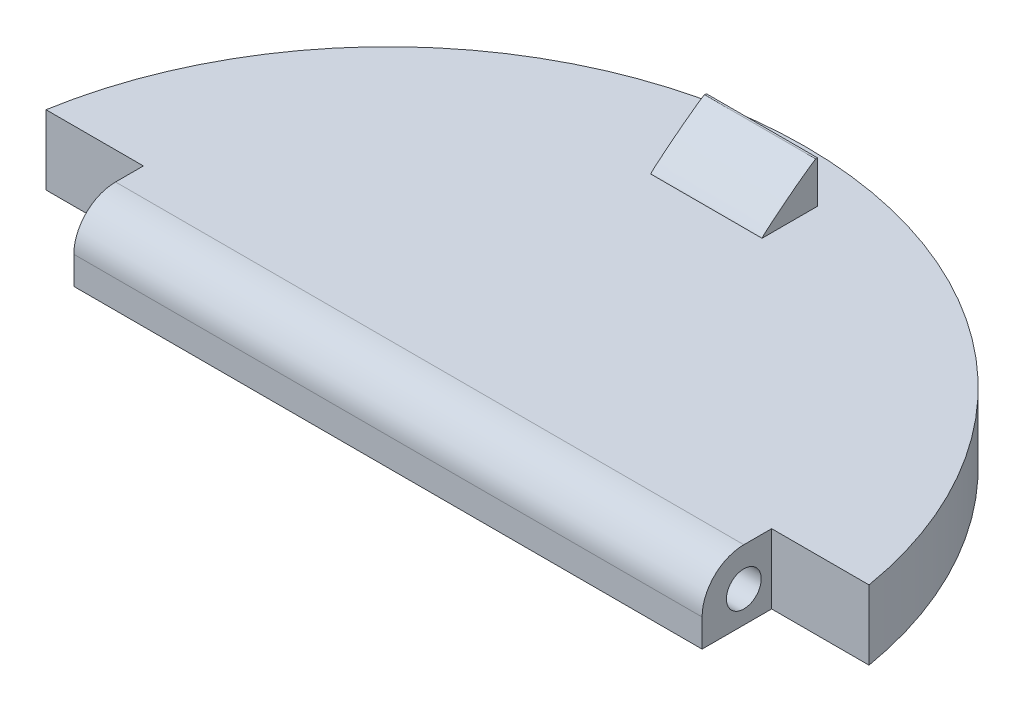
ISO-10303-21;
HEADER;
FILE_DESCRIPTION(('STEP AP214'),'2;1');
FILE_NAME('part.step','',(''),(''),'','','');
FILE_SCHEMA(('AUTOMOTIVE_DESIGN { 1 0 10303 214 1 1 1 1 }'));
ENDSEC;
DATA;
#1=APPLICATION_CONTEXT('core data for automotive mechanical design processes');
#2=APPLICATION_PROTOCOL_DEFINITION('international standard','automotive_design',2000,#1);
#3=PRODUCT_CONTEXT('',#1,'mechanical');
#4=PRODUCT('Part','Part','',(#3));
#5=PRODUCT_RELATED_PRODUCT_CATEGORY('part','',(#4));
#6=PRODUCT_DEFINITION_FORMATION('','',#4);
#7=PRODUCT_DEFINITION_CONTEXT('part definition',#1,'design');
#8=PRODUCT_DEFINITION('design','',#6,#7);
#9=PRODUCT_DEFINITION_SHAPE('','',#8);
#10=(LENGTH_UNIT() NAMED_UNIT(*) SI_UNIT(.MILLI.,.METRE.));
#11=(NAMED_UNIT(*) PLANE_ANGLE_UNIT() SI_UNIT($,.RADIAN.));
#12=(NAMED_UNIT(*) SI_UNIT($,.STERADIAN.) SOLID_ANGLE_UNIT());
#13=UNCERTAINTY_MEASURE_WITH_UNIT(LENGTH_MEASURE(1.E-05),#10,'distance_accuracy_value','');
#14=(GEOMETRIC_REPRESENTATION_CONTEXT(3) GLOBAL_UNCERTAINTY_ASSIGNED_CONTEXT((#13)) GLOBAL_UNIT_ASSIGNED_CONTEXT((#10,
#11,#12)) REPRESENTATION_CONTEXT('',''));
#15=CARTESIAN_POINT('',(0.,0.,0.));
#16=DIRECTION('',(0.,0.,1.));
#17=DIRECTION('',(1.,0.,0.));
#18=AXIS2_PLACEMENT_3D('',#15,#16,#17);
#19=CARTESIAN_POINT('',(0.,5.,0.));
#20=DIRECTION('',(0.,1.,0.));
#21=DIRECTION('',(0.,0.,1.));
#22=AXIS2_PLACEMENT_3D('',#19,#20,#21);
#23=PLANE('',#22);
#24=DIRECTION('',(0.,0.,-1.));
#25=VECTOR('',#24,1.);
#26=CARTESIAN_POINT('',(-22.5803989154981,5.,0.));
#27=LINE('',#26,#25);
#28=CARTESIAN_POINT('',(-22.5803989154981,5.,-3.));
#29=VERTEX_POINT('',#28);
#30=CARTESIAN_POINT('',(-22.5803989154981,5.,-5.));
#31=VERTEX_POINT('',#30);
#32=EDGE_CURVE('E125',#29,#31,#27,.T.);
#33=ORIENTED_EDGE('',*,*,#32,.F.);
#34=DIRECTION('',(1.,0.,0.));
#35=VECTOR('',#34,1.);
#36=CARTESIAN_POINT('',(22.5803989154981,5.,-3.));
#37=LINE('',#36,#35);
#38=CARTESIAN_POINT('',(22.5803989154981,5.,-3.));
#39=VERTEX_POINT('',#38);
#40=EDGE_CURVE('E241',#29,#39,#37,.T.);
#41=ORIENTED_EDGE('',*,*,#40,.T.);
#42=DIRECTION('',(0.,0.,1.));
#43=VECTOR('',#42,1.);
#44=CARTESIAN_POINT('',(22.5803989154981,5.,0.));
#45=LINE('',#44,#43);
#46=CARTESIAN_POINT('',(22.5803989154981,5.,-5.));
#47=VERTEX_POINT('',#46);
#48=EDGE_CURVE('E167',#47,#39,#45,.T.);
#49=ORIENTED_EDGE('',*,*,#48,.F.);
#50=DIRECTION('',(-1.,0.,0.));
#51=VECTOR('',#50,1.);
#52=CARTESIAN_POINT('',(22.5803989154981,5.,-5.));
#53=LINE('',#52,#51);
#54=CARTESIAN_POINT('',(29.5803989154981,5.,-5.));
#55=VERTEX_POINT('',#54);
#56=EDGE_CURVE('E163',#55,#47,#53,.T.);
#57=ORIENTED_EDGE('',*,*,#56,.F.);
#58=CARTESIAN_POINT('',(0.,5.,0.));
#59=DIRECTION('',(0.,1.,0.));
#60=DIRECTION('',(0.,0.,1.));
#61=AXIS2_PLACEMENT_3D('',#58,#59,#60);
#62=CIRCLE('',#61,30.);
#63=CARTESIAN_POINT('',(-29.5803989154981,5.,-5.));
#64=VERTEX_POINT('',#63);
#65=EDGE_CURVE('E153',#55,#64,#62,.T.);
#66=ORIENTED_EDGE('',*,*,#65,.T.);
#67=DIRECTION('',(-1.,0.,0.));
#68=VECTOR('',#67,1.);
#69=CARTESIAN_POINT('',(-22.5803989154981,5.,-5.));
#70=LINE('',#69,#68);
#71=EDGE_CURVE('E136',#31,#64,#70,.T.);
#72=ORIENTED_EDGE('',*,*,#71,.F.);
#73=EDGE_LOOP('',(#33,#41,#49,#57,#66,#72));
#74=FACE_BOUND('',#73,.T.);
#75=DIRECTION('',(-1.,0.,0.));
#76=VECTOR('',#75,1.);
#77=CARTESIAN_POINT('',(-3.84159331598207,5.,-26.7316665793187));
#78=LINE('',#77,#76);
#79=CARTESIAN_POINT('',(4.15840668401793,5.,-26.7316665793187));
#80=VERTEX_POINT('',#79);
#81=CARTESIAN_POINT('',(-3.84159331598207,5.,-26.7316665793187));
#82=VERTEX_POINT('',#81);
#83=EDGE_CURVE('E200',#80,#82,#78,.T.);
#84=ORIENTED_EDGE('',*,*,#83,.F.);
#85=DIRECTION('',(0.,0.,-1.));
#86=VECTOR('',#85,1.);
#87=CARTESIAN_POINT('',(4.15840668401793,5.,-26.7316665793187));
#88=LINE('',#87,#86);
#89=CARTESIAN_POINT('',(4.15840668401793,5.,-22.7316665793187));
#90=VERTEX_POINT('',#89);
#91=EDGE_CURVE('E161',#90,#80,#88,.T.);
#92=ORIENTED_EDGE('',*,*,#91,.F.);
#93=CARTESIAN_POINT('',(-4.24159331598207,5.,-22.7316665793187));
#94=CARTESIAN_POINT('',(-1.30825998264874,5.,-22.7316665793187));
#95=CARTESIAN_POINT('',(1.6250733506846,5.,-22.7316665793187));
#96=CARTESIAN_POINT('',(4.55840668401793,5.,-22.7316665793187));
#97=(BOUNDED_CURVE() B_SPLINE_CURVE(3,(#93,#94,#95,#96),.UNSPECIFIED.,.F.,
.F.) B_SPLINE_CURVE_WITH_KNOTS((4,4),(-0.00455840668401793,0.00424159331598207),
.UNSPECIFIED.) CURVE() GEOMETRIC_REPRESENTATION_ITEM() RATIONAL_B_SPLINE_CURVE((1.,1.,1.,1.)) REPRESENTATION_ITEM(''));
#98=CARTESIAN_POINT('',(-3.84159331598207,5.,-22.7316665793187));
#99=VERTEX_POINT('',#98);
#100=EDGE_CURVE('E188',#99,#90,#97,.T.);
#101=ORIENTED_EDGE('',*,*,#100,.F.);
#102=DIRECTION('',(0.,0.,1.));
#103=VECTOR('',#102,1.);
#104=CARTESIAN_POINT('',(-3.84159331598207,5.,-26.7316665793187));
#105=LINE('',#104,#103);
#106=EDGE_CURVE('E203',#82,#99,#105,.T.);
#107=ORIENTED_EDGE('',*,*,#106,.F.);
#108=EDGE_LOOP('',(#84,#92,#101,#107));
#109=FACE_BOUND('',#108,.T.);
#110=ADVANCED_FACE('F44',(#74,#109),#23,.T.);
#111=CARTESIAN_POINT('',(0.,5.,0.));
#112=DIRECTION('',(0.,-1.,0.));
#113=DIRECTION('',(0.,0.,-1.));
#114=AXIS2_PLACEMENT_3D('',#111,#112,#113);
#115=CYLINDRICAL_SURFACE('',#114,30.);
#116=CARTESIAN_POINT('',(0.,0.,0.));
#117=DIRECTION('',(0.,1.,0.));
#118=DIRECTION('',(0.,0.,1.));
#119=AXIS2_PLACEMENT_3D('',#116,#117,#118);
#120=CIRCLE('',#119,30.);
#121=CARTESIAN_POINT('',(29.5803989154981,0.,-5.));
#122=VERTEX_POINT('',#121);
#123=CARTESIAN_POINT('',(-29.5803989154981,0.,-5.));
#124=VERTEX_POINT('',#123);
#125=EDGE_CURVE('E210',#122,#124,#120,.T.);
#126=ORIENTED_EDGE('',*,*,#125,.T.);
#127=DIRECTION('',(0.,1.,0.));
#128=VECTOR('',#127,1.);
#129=CARTESIAN_POINT('',(-29.5803989154981,-5.,-5.));
#130=LINE('',#129,#128);
#131=EDGE_CURVE('E146',#124,#64,#130,.T.);
#132=ORIENTED_EDGE('',*,*,#131,.T.);
#133=ORIENTED_EDGE('',*,*,#65,.F.);
#134=DIRECTION('',(0.,1.,0.));
#135=VECTOR('',#134,1.);
#136=CARTESIAN_POINT('',(29.5803989154981,-5.,-5.));
#137=LINE('',#136,#135);
#138=EDGE_CURVE('E171',#122,#55,#137,.T.);
#139=ORIENTED_EDGE('',*,*,#138,.F.);
#140=EDGE_LOOP('',(#126,#132,#133,#139));
#141=FACE_BOUND('',#140,.T.);
#142=ADVANCED_FACE('F251',(#141),#115,.T.);
#143=CARTESIAN_POINT('',(-30.,5.,0.));
#144=DIRECTION('',(0.,0.,-1.));
#145=DIRECTION('',(-1.,0.,0.));
#146=AXIS2_PLACEMENT_3D('',#143,#144,#145);
#147=PLANE('',#146);
#148=DIRECTION('',(0.,1.,0.));
#149=VECTOR('',#148,1.);
#150=CARTESIAN_POINT('',(22.5803989154981,-5.,0.));
#151=LINE('',#150,#149);
#152=CARTESIAN_POINT('',(22.5803989154981,0.,0.));
#153=VERTEX_POINT('',#152);
#154=CARTESIAN_POINT('',(22.5803989154981,2.,0.));
#155=VERTEX_POINT('',#154);
#156=EDGE_CURVE('E137',#153,#155,#151,.T.);
#157=ORIENTED_EDGE('',*,*,#156,.T.);
#158=DIRECTION('',(1.,0.,0.));
#159=VECTOR('',#158,1.);
#160=CARTESIAN_POINT('',(-22.5803989154981,2.,0.));
#161=LINE('',#160,#159);
#162=CARTESIAN_POINT('',(-22.5803989154981,2.,0.));
#163=VERTEX_POINT('',#162);
#164=EDGE_CURVE('E52',#155,#163,#161,.F.);
#165=ORIENTED_EDGE('',*,*,#164,.T.);
#166=DIRECTION('',(0.,1.,0.));
#167=VECTOR('',#166,1.);
#168=CARTESIAN_POINT('',(-22.5803989154981,-5.,0.));
#169=LINE('',#168,#167);
#170=CARTESIAN_POINT('',(-22.5803989154981,0.,0.));
#171=VERTEX_POINT('',#170);
#172=EDGE_CURVE('E147',#171,#163,#169,.T.);
#173=ORIENTED_EDGE('',*,*,#172,.F.);
#174=DIRECTION('',(1.,0.,0.));
#175=VECTOR('',#174,1.);
#176=CARTESIAN_POINT('',(-30.,0.,0.));
#177=LINE('',#176,#175);
#178=EDGE_CURVE('E189',#171,#153,#177,.T.);
#179=ORIENTED_EDGE('',*,*,#178,.T.);
#180=EDGE_LOOP('',(#157,#165,#173,#179));
#181=FACE_BOUND('',#180,.T.);
#182=ADVANCED_FACE('F221',(#181),#147,.F.);
#183=CARTESIAN_POINT('',(0.,0.,0.));
#184=DIRECTION('',(0.,1.,0.));
#185=DIRECTION('',(0.,0.,1.));
#186=AXIS2_PLACEMENT_3D('',#183,#184,#185);
#187=PLANE('',#186);
#188=DIRECTION('',(0.,0.,-1.));
#189=VECTOR('',#188,1.);
#190=CARTESIAN_POINT('',(-22.5803989154981,0.,0.));
#191=LINE('',#190,#189);
#192=CARTESIAN_POINT('',(-22.5803989154981,0.,-5.));
#193=VERTEX_POINT('',#192);
#194=EDGE_CURVE('E225',#171,#193,#191,.T.);
#195=ORIENTED_EDGE('',*,*,#194,.T.);
#196=DIRECTION('',(-1.,0.,0.));
#197=VECTOR('',#196,1.);
#198=CARTESIAN_POINT('',(0.,0.,-5.));
#199=LINE('',#198,#197);
#200=EDGE_CURVE('E143',#193,#124,#199,.T.);
#201=ORIENTED_EDGE('',*,*,#200,.T.);
#202=ORIENTED_EDGE('',*,*,#125,.F.);
#203=DIRECTION('',(-1.,0.,0.));
#204=VECTOR('',#203,1.);
#205=CARTESIAN_POINT('',(0.,0.,-5.));
#206=LINE('',#205,#204);
#207=CARTESIAN_POINT('',(22.5803989154981,0.,-5.));
#208=VERTEX_POINT('',#207);
#209=EDGE_CURVE('E229',#122,#208,#206,.T.);
#210=ORIENTED_EDGE('',*,*,#209,.T.);
#211=DIRECTION('',(0.,0.,1.));
#212=VECTOR('',#211,1.);
#213=CARTESIAN_POINT('',(22.5803989154981,0.,0.));
#214=LINE('',#213,#212);
#215=EDGE_CURVE('E228',#208,#153,#214,.T.);
#216=ORIENTED_EDGE('',*,*,#215,.T.);
#217=ORIENTED_EDGE('',*,*,#178,.F.);
#218=EDGE_LOOP('',(#195,#201,#202,#210,#216,#217));
#219=FACE_BOUND('',#218,.T.);
#220=ADVANCED_FACE('F224',(#219),#187,.F.);
#221=CARTESIAN_POINT('',(4.15840668401793,8.,-26.7316665793187));
#222=DIRECTION('',(-1.,0.,0.));
#223=DIRECTION('',(0.,0.,1.));
#224=AXIS2_PLACEMENT_3D('',#221,#222,#223);
#225=PLANE('',#224);
#226=DIRECTION('',(0.,0.,-1.));
#227=VECTOR('',#226,1.);
#228=CARTESIAN_POINT('',(4.15840668401793,8.,-26.7316665793187));
#229=LINE('',#228,#227);
#230=CARTESIAN_POINT('',(4.15840668401793,8.,-26.6046499255261));
#231=VERTEX_POINT('',#230);
#232=CARTESIAN_POINT('',(4.15840668401793,8.,-26.7316665793187));
#233=VERTEX_POINT('',#232);
#234=EDGE_CURVE('E184',#231,#233,#229,.T.);
#235=ORIENTED_EDGE('',*,*,#234,.F.);
#236=CARTESIAN_POINT('',(4.15840668401793,5.,-22.7316665793187));
#237=CARTESIAN_POINT('',(4.15840668401793,8.,-23.5062632485602));
#238=CARTESIAN_POINT('',(4.15840668401793,8.,-26.6046499255261));
#239=(BOUNDED_CURVE() B_SPLINE_CURVE(2,(#236,#237,#238),.UNSPECIFIED.,.F.,
.F.) B_SPLINE_CURVE_WITH_KNOTS((3,3),(0.,1.),
.UNSPECIFIED.) CURVE() GEOMETRIC_REPRESENTATION_ITEM() RATIONAL_B_SPLINE_CURVE((1.,
0.0574959574576069,1.)) REPRESENTATION_ITEM(''));
#240=EDGE_CURVE('E350',#231,#90,#239,.F.);
#241=ORIENTED_EDGE('',*,*,#240,.T.);
#242=ORIENTED_EDGE('',*,*,#91,.T.);
#243=DIRECTION('',(0.,-1.,0.));
#244=VECTOR('',#243,1.);
#245=CARTESIAN_POINT('',(4.15840668401793,8.,-26.7316665793187));
#246=LINE('',#245,#244);
#247=EDGE_CURVE('E207',#233,#80,#246,.T.);
#248=ORIENTED_EDGE('',*,*,#247,.F.);
#249=EDGE_LOOP('',(#235,#241,#242,#248));
#250=FACE_BOUND('',#249,.T.);
#251=ADVANCED_FACE('F333',(#250),#225,.F.);
#252=CARTESIAN_POINT('',(-3.84159331598207,8.,-26.7316665793187));
#253=DIRECTION('',(0.,0.,1.));
#254=DIRECTION('',(1.,0.,0.));
#255=AXIS2_PLACEMENT_3D('',#252,#253,#254);
#256=PLANE('',#255);
#257=ORIENTED_EDGE('',*,*,#83,.T.);
#258=DIRECTION('',(0.,-1.,0.));
#259=VECTOR('',#258,1.);
#260=CARTESIAN_POINT('',(-3.84159331598207,8.,-26.7316665793187));
#261=LINE('',#260,#259);
#262=CARTESIAN_POINT('',(-3.84159331598207,8.,-26.7316665793187));
#263=VERTEX_POINT('',#262);
#264=EDGE_CURVE('E195',#263,#82,#261,.T.);
#265=ORIENTED_EDGE('',*,*,#264,.F.);
#266=DIRECTION('',(-1.,0.,0.));
#267=VECTOR('',#266,1.);
#268=CARTESIAN_POINT('',(-3.84159331598207,8.,-26.7316665793187));
#269=LINE('',#268,#267);
#270=EDGE_CURVE('E181',#233,#263,#269,.T.);
#271=ORIENTED_EDGE('',*,*,#270,.F.);
#272=ORIENTED_EDGE('',*,*,#247,.T.);
#273=EDGE_LOOP('',(#257,#265,#271,#272));
#274=FACE_BOUND('',#273,.T.);
#275=ADVANCED_FACE('F340',(#274),#256,.F.);
#276=CARTESIAN_POINT('',(-3.84159331598207,8.,-26.7316665793187));
#277=DIRECTION('',(1.,0.,0.));
#278=DIRECTION('',(0.,0.,-1.));
#279=AXIS2_PLACEMENT_3D('',#276,#277,#278);
#280=PLANE('',#279);
#281=ORIENTED_EDGE('',*,*,#106,.T.);
#282=CARTESIAN_POINT('',(-3.84159331598207,8.,-26.6046499255261));
#283=CARTESIAN_POINT('',(-3.84159331598207,8.,-23.5062632485602));
#284=CARTESIAN_POINT('',(-3.84159331598207,5.,-22.7316665793187));
#285=(BOUNDED_CURVE() B_SPLINE_CURVE(2,(#282,#283,#284),.UNSPECIFIED.,.F.,
.F.) B_SPLINE_CURVE_WITH_KNOTS((3,3),(0.,1.),
.UNSPECIFIED.) CURVE() GEOMETRIC_REPRESENTATION_ITEM() RATIONAL_B_SPLINE_CURVE((1.,
0.0574959574576069,1.)) REPRESENTATION_ITEM(''));
#286=CARTESIAN_POINT('',(-3.84159331598207,8.,-26.6046499255261));
#287=VERTEX_POINT('',#286);
#288=EDGE_CURVE('E235',#99,#287,#285,.F.);
#289=ORIENTED_EDGE('',*,*,#288,.T.);
#290=DIRECTION('',(0.,0.,1.));
#291=VECTOR('',#290,1.);
#292=CARTESIAN_POINT('',(-3.84159331598207,8.,-26.7316665793187));
#293=LINE('',#292,#291);
#294=EDGE_CURVE('E191',#263,#287,#293,.T.);
#295=ORIENTED_EDGE('',*,*,#294,.F.);
#296=ORIENTED_EDGE('',*,*,#264,.T.);
#297=EDGE_LOOP('',(#281,#289,#295,#296));
#298=FACE_BOUND('',#297,.T.);
#299=ADVANCED_FACE('F345',(#298),#280,.F.);
#300=CARTESIAN_POINT('',(0.,8.,0.));
#301=DIRECTION('',(0.,1.,0.));
#302=DIRECTION('',(0.,0.,1.));
#303=AXIS2_PLACEMENT_3D('',#300,#301,#302);
#304=PLANE('',#303);
#305=ORIENTED_EDGE('',*,*,#294,.T.);
#306=CARTESIAN_POINT('',(4.55840668401793,8.,-26.6046499255261));
#307=CARTESIAN_POINT('',(1.6250733506846,8.,-26.6046499255261));
#308=CARTESIAN_POINT('',(-1.30825998264874,8.,-26.6046499255261));
#309=CARTESIAN_POINT('',(-4.24159331598207,8.,-26.6046499255261));
#310=(BOUNDED_CURVE() B_SPLINE_CURVE(3,(#306,#307,#308,#309),.UNSPECIFIED.,.F.,
.F.) B_SPLINE_CURVE_WITH_KNOTS((4,4),(-0.00455840668401793,0.00424159331598207),
.UNSPECIFIED.) CURVE() GEOMETRIC_REPRESENTATION_ITEM() RATIONAL_B_SPLINE_CURVE((1.,1.,1.,1.)) REPRESENTATION_ITEM(''));
#311=EDGE_CURVE('E212',#287,#231,#310,.F.);
#312=ORIENTED_EDGE('',*,*,#311,.T.);
#313=ORIENTED_EDGE('',*,*,#234,.T.);
#314=ORIENTED_EDGE('',*,*,#270,.T.);
#315=EDGE_LOOP('',(#305,#312,#313,#314));
#316=FACE_BOUND('',#315,.T.);
#317=ADVANCED_FACE('F271',(#316),#304,.T.);
#318=CARTESIAN_POINT('',(4.55840668401793,5.,-22.7316665793187));
#319=CARTESIAN_POINT('',(1.6250733506846,5.,-22.7316665793187));
#320=CARTESIAN_POINT('',(-1.30825998264874,5.,-22.7316665793187));
#321=CARTESIAN_POINT('',(-4.24159331598207,5.,-22.7316665793187));
#322=CARTESIAN_POINT('',(4.55840668401793,8.,-23.5062632485602));
#323=CARTESIAN_POINT('',(1.6250733506846,8.,-23.5062632485602));
#324=CARTESIAN_POINT('',(-1.30825998264874,8.,-23.5062632485602));
#325=CARTESIAN_POINT('',(-4.24159331598207,8.,-23.5062632485602));
#326=CARTESIAN_POINT('',(4.55840668401793,8.,-26.6046499255261));
#327=CARTESIAN_POINT('',(1.6250733506846,8.,-26.6046499255261));
#328=CARTESIAN_POINT('',(-1.30825998264874,8.,-26.6046499255261));
#329=CARTESIAN_POINT('',(-4.24159331598207,8.,-26.6046499255261));
#330=(BOUNDED_SURFACE() B_SPLINE_SURFACE(2,3,((#318,#319,#320,#321),(#322,#323,#324,#325),(#326,
#327,#328,#329)),.UNSPECIFIED.,.F.,.F.,.F.) B_SPLINE_SURFACE_WITH_KNOTS((3,3),(4,4),(0.,1.),
(-0.00455840668401793,0.00424159331598207),
.UNSPECIFIED.) GEOMETRIC_REPRESENTATION_ITEM() RATIONAL_B_SPLINE_SURFACE(((1.,1.,1.,1.),
(0.0574959574576069,0.0574959574576069,0.0574959574576069,0.0574959574576069),(1.,1.,1.,1.))) REPRESENTATION_ITEM('') SURFACE());
#331=ORIENTED_EDGE('',*,*,#288,.F.);
#332=ORIENTED_EDGE('',*,*,#100,.T.);
#333=ORIENTED_EDGE('',*,*,#240,.F.);
#334=ORIENTED_EDGE('',*,*,#311,.F.);
#335=EDGE_LOOP('',(#331,#332,#333,#334));
#336=FACE_BOUND('',#335,.T.);
#337=ADVANCED_FACE('F264',(#336),#330,.T.);
#338=CARTESIAN_POINT('',(22.5803989154981,-5.,0.));
#339=DIRECTION('',(-1.,0.,0.));
#340=DIRECTION('',(0.,0.,1.));
#341=AXIS2_PLACEMENT_3D('',#338,#339,#340);
#342=PLANE('',#341);
#343=CARTESIAN_POINT('',(22.5803989154981,2.25,-3.));
#344=DIRECTION('',(1.,0.,0.));
#345=DIRECTION('',(0.,0.,-1.));
#346=AXIS2_PLACEMENT_3D('',#343,#344,#345);
#347=CIRCLE('',#346,1.25);
#348=CARTESIAN_POINT('',(22.5803989154981,2.25,-4.25));
#349=VERTEX_POINT('',#348);
#350=EDGE_CURVE('E425',#349,#349,#347,.T.);
#351=ORIENTED_EDGE('',*,*,#350,.F.);
#352=EDGE_LOOP('',(#351));
#353=FACE_BOUND('',#352,.T.);
#354=ORIENTED_EDGE('',*,*,#48,.T.);
#355=CARTESIAN_POINT('',(22.5803989154981,2.,-3.));
#356=DIRECTION('',(-1.,0.,0.));
#357=DIRECTION('',(0.,0.,1.));
#358=AXIS2_PLACEMENT_3D('',#355,#356,#357);
#359=CIRCLE('',#358,3.);
#360=EDGE_CURVE('E66',#39,#155,#359,.F.);
#361=ORIENTED_EDGE('',*,*,#360,.T.);
#362=ORIENTED_EDGE('',*,*,#156,.F.);
#363=ORIENTED_EDGE('',*,*,#215,.F.);
#364=DIRECTION('',(0.,1.,0.));
#365=VECTOR('',#364,1.);
#366=CARTESIAN_POINT('',(22.5803989154981,-5.,-5.));
#367=LINE('',#366,#365);
#368=EDGE_CURVE('E174',#208,#47,#367,.T.);
#369=ORIENTED_EDGE('',*,*,#368,.T.);
#370=EDGE_LOOP('',(#354,#361,#362,#363,#369));
#371=FACE_BOUND('',#370,.T.);
#372=ADVANCED_FACE('F248',(#353,#371),#342,.F.);
#373=CARTESIAN_POINT('',(22.5803989154981,-5.,-5.));
#374=DIRECTION('',(0.,0.,-1.));
#375=DIRECTION('',(-1.,0.,0.));
#376=AXIS2_PLACEMENT_3D('',#373,#374,#375);
#377=PLANE('',#376);
#378=ORIENTED_EDGE('',*,*,#138,.T.);
#379=ORIENTED_EDGE('',*,*,#56,.T.);
#380=ORIENTED_EDGE('',*,*,#368,.F.);
#381=ORIENTED_EDGE('',*,*,#209,.F.);
#382=EDGE_LOOP('',(#378,#379,#380,#381));
#383=FACE_BOUND('',#382,.T.);
#384=ADVANCED_FACE('F250',(#383),#377,.F.);
#385=CARTESIAN_POINT('',(-22.5803989154981,-5.,-5.));
#386=DIRECTION('',(0.,0.,-1.));
#387=DIRECTION('',(-1.,0.,0.));
#388=AXIS2_PLACEMENT_3D('',#385,#386,#387);
#389=PLANE('',#388);
#390=DIRECTION('',(0.,1.,0.));
#391=VECTOR('',#390,1.);
#392=CARTESIAN_POINT('',(-22.5803989154981,-5.,-5.));
#393=LINE('',#392,#391);
#394=EDGE_CURVE('E128',#193,#31,#393,.T.);
#395=ORIENTED_EDGE('',*,*,#394,.T.);
#396=ORIENTED_EDGE('',*,*,#71,.T.);
#397=ORIENTED_EDGE('',*,*,#131,.F.);
#398=ORIENTED_EDGE('',*,*,#200,.F.);
#399=EDGE_LOOP('',(#395,#396,#397,#398));
#400=FACE_BOUND('',#399,.T.);
#401=ADVANCED_FACE('F140',(#400),#389,.F.);
#402=CARTESIAN_POINT('',(-22.5803989154981,-5.,0.));
#403=DIRECTION('',(1.,0.,0.));
#404=DIRECTION('',(0.,0.,-1.));
#405=AXIS2_PLACEMENT_3D('',#402,#403,#404);
#406=PLANE('',#405);
#407=CARTESIAN_POINT('',(-22.5803989154981,2.25,-3.));
#408=DIRECTION('',(-1.,0.,0.));
#409=DIRECTION('',(0.,0.,1.));
#410=AXIS2_PLACEMENT_3D('',#407,#408,#409);
#411=CIRCLE('',#410,1.25);
#412=CARTESIAN_POINT('',(-22.5803989154981,2.25,-1.75));
#413=VERTEX_POINT('',#412);
#414=EDGE_CURVE('E426',#413,#413,#411,.T.);
#415=ORIENTED_EDGE('',*,*,#414,.F.);
#416=EDGE_LOOP('',(#415));
#417=FACE_BOUND('',#416,.T.);
#418=ORIENTED_EDGE('',*,*,#172,.T.);
#419=CARTESIAN_POINT('',(-22.5803989154981,2.,-3.));
#420=DIRECTION('',(1.,0.,0.));
#421=DIRECTION('',(0.,0.,-1.));
#422=AXIS2_PLACEMENT_3D('',#419,#420,#421);
#423=CIRCLE('',#422,3.);
#424=EDGE_CURVE('E12',#163,#29,#423,.F.);
#425=ORIENTED_EDGE('',*,*,#424,.T.);
#426=ORIENTED_EDGE('',*,*,#32,.T.);
#427=ORIENTED_EDGE('',*,*,#394,.F.);
#428=ORIENTED_EDGE('',*,*,#194,.F.);
#429=EDGE_LOOP('',(#418,#425,#426,#427,#428));
#430=FACE_BOUND('',#429,.T.);
#431=ADVANCED_FACE('F127',(#417,#430),#406,.F.);
#432=CARTESIAN_POINT('',(0.,2.,-3.));
#433=DIRECTION('',(-1.,0.,0.));
#434=DIRECTION('',(0.,0.,1.));
#435=AXIS2_PLACEMENT_3D('',#432,#433,#434);
#436=CYLINDRICAL_SURFACE('',#435,3.);
#437=ORIENTED_EDGE('',*,*,#424,.F.);
#438=ORIENTED_EDGE('',*,*,#164,.F.);
#439=ORIENTED_EDGE('',*,*,#360,.F.);
#440=ORIENTED_EDGE('',*,*,#40,.F.);
#441=EDGE_LOOP('',(#437,#438,#439,#440));
#442=FACE_BOUND('',#441,.T.);
#443=ADVANCED_FACE('F46',(#442),#436,.T.);
#444=CARTESIAN_POINT('',(17.5803989154981,2.25,-3.));
#445=DIRECTION('',(1.,0.,0.));
#446=DIRECTION('',(0.,0.,-1.));
#447=AXIS2_PLACEMENT_3D('',#444,#445,#446);
#448=CYLINDRICAL_SURFACE('',#447,1.25);
#449=CARTESIAN_POINT('',(17.5803989154981,2.25,-3.));
#450=DIRECTION('',(1.,0.,0.));
#451=DIRECTION('',(0.,0.,-1.));
#452=AXIS2_PLACEMENT_3D('',#449,#450,#451);
#453=CIRCLE('',#452,1.25);
#454=CARTESIAN_POINT('',(17.5803989154981,2.25,-4.25));
#455=VERTEX_POINT('',#454);
#456=EDGE_CURVE('E168',#455,#455,#453,.T.);
#457=ORIENTED_EDGE('',*,*,#456,.F.);
#458=EDGE_LOOP('',(#457));
#459=FACE_BOUND('',#458,.T.);
#460=ORIENTED_EDGE('',*,*,#350,.T.);
#461=EDGE_LOOP('',(#460));
#462=FACE_BOUND('',#461,.T.);
#463=ADVANCED_FACE('F404',(#459,#462),#448,.F.);
#464=CARTESIAN_POINT('',(17.5803989154981,2.25,-3.));
#465=DIRECTION('',(1.,0.,0.));
#466=DIRECTION('',(0.,0.,-1.));
#467=AXIS2_PLACEMENT_3D('',#464,#465,#466);
#468=PLANE('',#467);
#469=ORIENTED_EDGE('',*,*,#456,.T.);
#470=EDGE_LOOP('',(#469));
#471=FACE_BOUND('',#470,.T.);
#472=ADVANCED_FACE('F407',(#471),#468,.T.);
#473=CARTESIAN_POINT('',(-17.5803989154981,2.25,-3.));
#474=DIRECTION('',(-1.,0.,0.));
#475=DIRECTION('',(0.,0.,1.));
#476=AXIS2_PLACEMENT_3D('',#473,#474,#475);
#477=CYLINDRICAL_SURFACE('',#476,1.25);
#478=CARTESIAN_POINT('',(-17.5803989154981,2.25,-3.));
#479=DIRECTION('',(-1.,0.,0.));
#480=DIRECTION('',(0.,0.,1.));
#481=AXIS2_PLACEMENT_3D('',#478,#479,#480);
#482=CIRCLE('',#481,1.25);
#483=CARTESIAN_POINT('',(-17.5803989154981,2.25,-1.75));
#484=VERTEX_POINT('',#483);
#485=EDGE_CURVE('E423',#484,#484,#482,.T.);
#486=ORIENTED_EDGE('',*,*,#485,.F.);
#487=EDGE_LOOP('',(#486));
#488=FACE_BOUND('',#487,.T.);
#489=ORIENTED_EDGE('',*,*,#414,.T.);
#490=EDGE_LOOP('',(#489));
#491=FACE_BOUND('',#490,.T.);
#492=ADVANCED_FACE('F411',(#488,#491),#477,.F.);
#493=CARTESIAN_POINT('',(-17.5803989154981,2.25,-3.));
#494=DIRECTION('',(-1.,0.,0.));
#495=DIRECTION('',(0.,0.,1.));
#496=AXIS2_PLACEMENT_3D('',#493,#494,#495);
#497=PLANE('',#496);
#498=ORIENTED_EDGE('',*,*,#485,.T.);
#499=EDGE_LOOP('',(#498));
#500=FACE_BOUND('',#499,.T.);
#501=ADVANCED_FACE('F415',(#500),#497,.T.);
#502=CLOSED_SHELL('',(#110,#142,#182,#220,#251,#275,#299,#317,#337,#372,#384,#401,#431,#443,
#463,#472,#492,#501));
#503=MANIFOLD_SOLID_BREP('B2',#502);
#504=ADVANCED_BREP_SHAPE_REPRESENTATION('',(#18,#503),#14);
#505=SHAPE_DEFINITION_REPRESENTATION(#9,#504);
ENDSEC;
END-ISO-10303-21;
